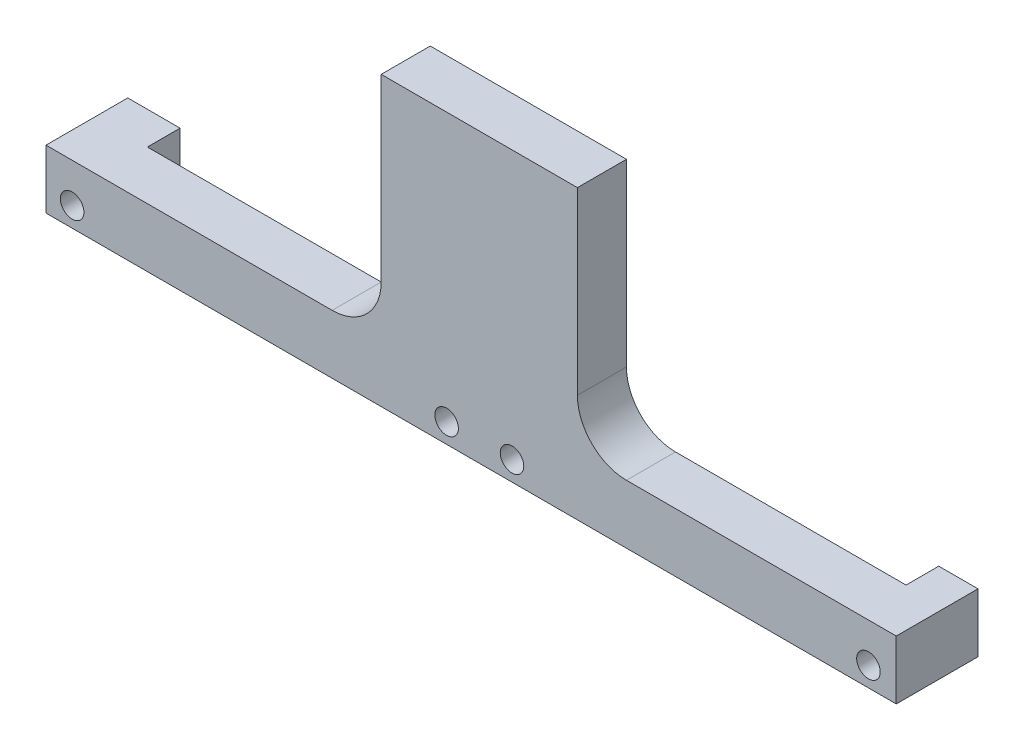
ISO-10303-21;
HEADER;
FILE_DESCRIPTION(('STEP AP214'),'2;1');
FILE_NAME('part.step','',(''),(''),'','','');
FILE_SCHEMA(('AUTOMOTIVE_DESIGN { 1 0 10303 214 1 1 1 1 }'));
ENDSEC;
DATA;
#1=APPLICATION_CONTEXT('core data for automotive mechanical design processes');
#2=APPLICATION_PROTOCOL_DEFINITION('international standard','automotive_design',2000,#1);
#3=PRODUCT_CONTEXT('',#1,'mechanical');
#4=PRODUCT('Part','Part','',(#3));
#5=PRODUCT_RELATED_PRODUCT_CATEGORY('part','',(#4));
#6=PRODUCT_DEFINITION_FORMATION('','',#4);
#7=PRODUCT_DEFINITION_CONTEXT('part definition',#1,'design');
#8=PRODUCT_DEFINITION('design','',#6,#7);
#9=PRODUCT_DEFINITION_SHAPE('','',#8);
#10=(LENGTH_UNIT() NAMED_UNIT(*) SI_UNIT(.MILLI.,.METRE.));
#11=(NAMED_UNIT(*) PLANE_ANGLE_UNIT() SI_UNIT($,.RADIAN.));
#12=(NAMED_UNIT(*) SI_UNIT($,.STERADIAN.) SOLID_ANGLE_UNIT());
#13=UNCERTAINTY_MEASURE_WITH_UNIT(LENGTH_MEASURE(1.E-05),#10,'distance_accuracy_value','');
#14=(GEOMETRIC_REPRESENTATION_CONTEXT(3) GLOBAL_UNCERTAINTY_ASSIGNED_CONTEXT((#13)) GLOBAL_UNIT_ASSIGNED_CONTEXT((#10,
#11,#12)) REPRESENTATION_CONTEXT('',''));
#15=CARTESIAN_POINT('',(0.,0.,0.));
#16=DIRECTION('',(0.,0.,1.));
#17=DIRECTION('',(1.,0.,0.));
#18=AXIS2_PLACEMENT_3D('',#15,#16,#17);
#19=CARTESIAN_POINT('',(0.,0.,0.));
#20=DIRECTION('',(0.,0.,1.));
#21=DIRECTION('',(1.,0.,0.));
#22=AXIS2_PLACEMENT_3D('',#19,#20,#21);
#23=PLANE('',#22);
#24=DIRECTION('',(0.,1.,0.));
#25=VECTOR('',#24,1.);
#26=CARTESIAN_POINT('',(124.,0.,0.));
#27=LINE('',#26,#25);
#28=CARTESIAN_POINT('',(124.,0.,0.));
#29=VERTEX_POINT('',#28);
#30=CARTESIAN_POINT('',(124.,2.57869251134121,0.));
#31=VERTEX_POINT('',#30);
#32=EDGE_CURVE('E54',#29,#31,#27,.T.);
#33=ORIENTED_EDGE('',*,*,#32,.F.);
#34=DIRECTION('',(1.,0.,0.));
#35=VECTOR('',#34,1.);
#36=CARTESIAN_POINT('',(0.,0.,0.));
#37=LINE('',#36,#35);
#38=CARTESIAN_POINT('',(76.25,0.,0.));
#39=VERTEX_POINT('',#38);
#40=EDGE_CURVE('E280',#39,#29,#37,.T.);
#41=ORIENTED_EDGE('',*,*,#40,.F.);
#42=DIRECTION('',(0.,-1.,0.));
#43=VECTOR('',#42,1.);
#44=CARTESIAN_POINT('',(76.25,0.,0.));
#45=LINE('',#44,#43);
#46=CARTESIAN_POINT('',(76.25,6.,0.));
#47=VERTEX_POINT('',#46);
#48=EDGE_CURVE('E240',#47,#39,#45,.T.);
#49=ORIENTED_EDGE('',*,*,#48,.F.);
#50=DIRECTION('',(1.,0.,0.));
#51=VECTOR('',#50,1.);
#52=CARTESIAN_POINT('',(76.25,6.,0.));
#53=LINE('',#52,#51);
#54=CARTESIAN_POINT('',(56.25,6.,0.));
#55=VERTEX_POINT('',#54);
#56=EDGE_CURVE('E245',#55,#47,#53,.T.);
#57=ORIENTED_EDGE('',*,*,#56,.F.);
#58=DIRECTION('',(0.,1.,0.));
#59=VECTOR('',#58,1.);
#60=CARTESIAN_POINT('',(56.25,0.,0.));
#61=LINE('',#60,#59);
#62=CARTESIAN_POINT('',(56.25,0.,0.));
#63=VERTEX_POINT('',#62);
#64=EDGE_CURVE('E254',#63,#55,#61,.T.);
#65=ORIENTED_EDGE('',*,*,#64,.F.);
#66=CARTESIAN_POINT('',(8.,0.,0.));
#67=VERTEX_POINT('',#66);
#68=EDGE_CURVE('E302',#67,#63,#37,.T.);
#69=ORIENTED_EDGE('',*,*,#68,.F.);
#70=DIRECTION('',(0.,-1.,0.));
#71=VECTOR('',#70,1.);
#72=CARTESIAN_POINT('',(8.,0.,0.));
#73=LINE('',#72,#71);
#74=CARTESIAN_POINT('',(8.,8.99999999999999,0.));
#75=VERTEX_POINT('',#74);
#76=EDGE_CURVE('E220',#75,#67,#73,.T.);
#77=ORIENTED_EDGE('',*,*,#76,.F.);
#78=DIRECTION('',(-1.,0.,0.));
#79=VECTOR('',#78,1.);
#80=CARTESIAN_POINT('',(51.25,8.99999999999999,0.));
#81=LINE('',#80,#79);
#82=CARTESIAN_POINT('',(43.75,8.99999999999999,0.));
#83=VERTEX_POINT('',#82);
#84=EDGE_CURVE('E285',#83,#75,#81,.T.);
#85=ORIENTED_EDGE('',*,*,#84,.F.);
#86=CARTESIAN_POINT('',(43.75,16.5,0.));
#87=DIRECTION('',(0.,0.,1.));
#88=DIRECTION('',(1.,0.,0.));
#89=AXIS2_PLACEMENT_3D('',#86,#87,#88);
#90=CIRCLE('',#89,7.5);
#91=CARTESIAN_POINT('',(51.25,16.5,0.));
#92=VERTEX_POINT('',#91);
#93=EDGE_CURVE('E47',#83,#92,#90,.T.);
#94=ORIENTED_EDGE('',*,*,#93,.T.);
#95=DIRECTION('',(0.,-1.,0.));
#96=VECTOR('',#95,1.);
#97=CARTESIAN_POINT('',(51.25,44.,0.));
#98=LINE('',#97,#96);
#99=CARTESIAN_POINT('',(51.25,44.,0.));
#100=VERTEX_POINT('',#99);
#101=EDGE_CURVE('E309',#100,#92,#98,.T.);
#102=ORIENTED_EDGE('',*,*,#101,.F.);
#103=DIRECTION('',(-1.,0.,0.));
#104=VECTOR('',#103,1.);
#105=CARTESIAN_POINT('',(81.25,44.,0.));
#106=LINE('',#105,#104);
#107=CARTESIAN_POINT('',(81.25,44.,0.));
#108=VERTEX_POINT('',#107);
#109=EDGE_CURVE('E307',#108,#100,#106,.T.);
#110=ORIENTED_EDGE('',*,*,#109,.F.);
#111=DIRECTION('',(0.,1.,0.));
#112=VECTOR('',#111,1.);
#113=CARTESIAN_POINT('',(81.25,8.99999999999999,0.));
#114=LINE('',#113,#112);
#115=CARTESIAN_POINT('',(81.25,16.5,0.));
#116=VERTEX_POINT('',#115);
#117=EDGE_CURVE('E305',#116,#108,#114,.T.);
#118=ORIENTED_EDGE('',*,*,#117,.F.);
#119=CARTESIAN_POINT('',(88.75,16.5,0.));
#120=DIRECTION('',(0.,0.,1.));
#121=DIRECTION('',(1.,0.,0.));
#122=AXIS2_PLACEMENT_3D('',#119,#120,#121);
#123=CIRCLE('',#122,7.5);
#124=CARTESIAN_POINT('',(88.75,8.99999999999999,0.));
#125=VERTEX_POINT('',#124);
#126=EDGE_CURVE('E337',#116,#125,#123,.T.);
#127=ORIENTED_EDGE('',*,*,#126,.T.);
#128=DIRECTION('',(-1.,0.,0.));
#129=VECTOR('',#128,1.);
#130=CARTESIAN_POINT('',(130.,9.,0.));
#131=LINE('',#130,#129);
#132=CARTESIAN_POINT('',(124.,9.,0.));
#133=VERTEX_POINT('',#132);
#134=EDGE_CURVE('E61',#133,#125,#131,.T.);
#135=ORIENTED_EDGE('',*,*,#134,.F.);
#136=DIRECTION('',(0.,1.,0.));
#137=VECTOR('',#136,1.);
#138=CARTESIAN_POINT('',(124.,9.,0.));
#139=LINE('',#138,#137);
#140=CARTESIAN_POINT('',(124.,3.42130748865879,0.));
#141=VERTEX_POINT('',#140);
#142=EDGE_CURVE('E186',#141,#133,#139,.T.);
#143=ORIENTED_EDGE('',*,*,#142,.F.);
#144=CARTESIAN_POINT('',(125.75,3.,0.));
#145=DIRECTION('',(0.,0.,1.));
#146=DIRECTION('',(1.,0.,0.));
#147=AXIS2_PLACEMENT_3D('',#144,#145,#146);
#148=CIRCLE('',#147,1.80000000000001);
#149=EDGE_CURVE('E175',#141,#31,#148,.T.);
#150=ORIENTED_EDGE('',*,*,#149,.T.);
#151=EDGE_LOOP('',(#33,#41,#49,#57,#65,#69,#77,#85,#94,#102,#110,#118,#127,#135,#143,#150));
#152=FACE_BOUND('',#151,.T.);
#153=ADVANCED_FACE('F39',(#152),#23,.F.);
#154=CARTESIAN_POINT('',(0.,0.,7.5));
#155=DIRECTION('',(0.,0.,1.));
#156=DIRECTION('',(1.,0.,0.));
#157=AXIS2_PLACEMENT_3D('',#154,#155,#156);
#158=PLANE('',#157);
#159=CARTESIAN_POINT('',(71.25,3.,7.5));
#160=DIRECTION('',(0.,0.,1.));
#161=DIRECTION('',(1.,0.,0.));
#162=AXIS2_PLACEMENT_3D('',#159,#160,#161);
#163=CIRCLE('',#162,1.79999999999999);
#164=CARTESIAN_POINT('',(73.05,3.,7.5));
#165=VERTEX_POINT('',#164);
#166=EDGE_CURVE('E270',#165,#165,#163,.T.);
#167=ORIENTED_EDGE('',*,*,#166,.F.);
#168=EDGE_LOOP('',(#167));
#169=FACE_BOUND('',#168,.T.);
#170=CARTESIAN_POINT('',(4.,3.,7.5));
#171=DIRECTION('',(0.,0.,1.));
#172=DIRECTION('',(1.,0.,0.));
#173=AXIS2_PLACEMENT_3D('',#170,#171,#172);
#174=CIRCLE('',#173,1.8);
#175=CARTESIAN_POINT('',(5.8,3.,7.5));
#176=VERTEX_POINT('',#175);
#177=EDGE_CURVE('E277',#176,#176,#174,.T.);
#178=ORIENTED_EDGE('',*,*,#177,.F.);
#179=EDGE_LOOP('',(#178));
#180=FACE_BOUND('',#179,.T.);
#181=DIRECTION('',(0.,-1.,0.));
#182=VECTOR('',#181,1.);
#183=CARTESIAN_POINT('',(0.,9.,7.5));
#184=LINE('',#183,#182);
#185=CARTESIAN_POINT('',(0.,9.,7.5));
#186=VERTEX_POINT('',#185);
#187=CARTESIAN_POINT('',(0.,0.,7.5));
#188=VERTEX_POINT('',#187);
#189=EDGE_CURVE('E281',#186,#188,#184,.T.);
#190=ORIENTED_EDGE('',*,*,#189,.T.);
#191=DIRECTION('',(1.,0.,0.));
#192=VECTOR('',#191,1.);
#193=CARTESIAN_POINT('',(0.,0.,7.5));
#194=LINE('',#193,#192);
#195=CARTESIAN_POINT('',(130.,0.,7.5));
#196=VERTEX_POINT('',#195);
#197=EDGE_CURVE('E284',#188,#196,#194,.T.);
#198=ORIENTED_EDGE('',*,*,#197,.T.);
#199=DIRECTION('',(0.,1.,0.));
#200=VECTOR('',#199,1.);
#201=CARTESIAN_POINT('',(130.,0.,7.5));
#202=LINE('',#201,#200);
#203=CARTESIAN_POINT('',(130.,9.,7.5));
#204=VERTEX_POINT('',#203);
#205=EDGE_CURVE('E287',#196,#204,#202,.T.);
#206=ORIENTED_EDGE('',*,*,#205,.T.);
#207=DIRECTION('',(-1.,0.,0.));
#208=VECTOR('',#207,1.);
#209=CARTESIAN_POINT('',(130.,9.,7.5));
#210=LINE('',#209,#208);
#211=CARTESIAN_POINT('',(88.75,8.99999999999999,7.5));
#212=VERTEX_POINT('',#211);
#213=EDGE_CURVE('E289',#204,#212,#210,.T.);
#214=ORIENTED_EDGE('',*,*,#213,.T.);
#215=CARTESIAN_POINT('',(88.75,16.5,7.5));
#216=DIRECTION('',(0.,0.,1.));
#217=DIRECTION('',(1.,0.,0.));
#218=AXIS2_PLACEMENT_3D('',#215,#216,#217);
#219=CIRCLE('',#218,7.5);
#220=CARTESIAN_POINT('',(81.25,16.5,7.5));
#221=VERTEX_POINT('',#220);
#222=EDGE_CURVE('E339',#212,#221,#219,.F.);
#223=ORIENTED_EDGE('',*,*,#222,.T.);
#224=DIRECTION('',(0.,1.,0.));
#225=VECTOR('',#224,1.);
#226=CARTESIAN_POINT('',(81.25,8.99999999999999,7.5));
#227=LINE('',#226,#225);
#228=CARTESIAN_POINT('',(81.25,44.,7.5));
#229=VERTEX_POINT('',#228);
#230=EDGE_CURVE('E292',#221,#229,#227,.T.);
#231=ORIENTED_EDGE('',*,*,#230,.T.);
#232=DIRECTION('',(-1.,0.,0.));
#233=VECTOR('',#232,1.);
#234=CARTESIAN_POINT('',(81.25,44.,7.5));
#235=LINE('',#234,#233);
#236=CARTESIAN_POINT('',(51.25,44.,7.5));
#237=VERTEX_POINT('',#236);
#238=EDGE_CURVE('E294',#229,#237,#235,.T.);
#239=ORIENTED_EDGE('',*,*,#238,.T.);
#240=DIRECTION('',(0.,-1.,0.));
#241=VECTOR('',#240,1.);
#242=CARTESIAN_POINT('',(51.25,44.,7.5));
#243=LINE('',#242,#241);
#244=CARTESIAN_POINT('',(51.25,16.5,7.5));
#245=VERTEX_POINT('',#244);
#246=EDGE_CURVE('E296',#237,#245,#243,.T.);
#247=ORIENTED_EDGE('',*,*,#246,.T.);
#248=CARTESIAN_POINT('',(43.75,16.5,7.5));
#249=DIRECTION('',(0.,0.,1.));
#250=DIRECTION('',(1.,0.,0.));
#251=AXIS2_PLACEMENT_3D('',#248,#249,#250);
#252=CIRCLE('',#251,7.5);
#253=CARTESIAN_POINT('',(43.75,8.99999999999999,7.5));
#254=VERTEX_POINT('',#253);
#255=EDGE_CURVE('E11',#245,#254,#252,.F.);
#256=ORIENTED_EDGE('',*,*,#255,.T.);
#257=DIRECTION('',(-1.,0.,0.));
#258=VECTOR('',#257,1.);
#259=CARTESIAN_POINT('',(51.25,8.99999999999999,7.5));
#260=LINE('',#259,#258);
#261=EDGE_CURVE('E299',#254,#186,#260,.T.);
#262=ORIENTED_EDGE('',*,*,#261,.T.);
#263=EDGE_LOOP('',(#190,#198,#206,#214,#223,#231,#239,#247,#256,#262));
#264=FACE_BOUND('',#263,.T.);
#265=CARTESIAN_POINT('',(61.25,3.,7.5));
#266=DIRECTION('',(0.,0.,1.));
#267=DIRECTION('',(1.,0.,0.));
#268=AXIS2_PLACEMENT_3D('',#265,#266,#267);
#269=CIRCLE('',#268,1.79999999999999);
#270=CARTESIAN_POINT('',(63.05,3.,7.5));
#271=VERTEX_POINT('',#270);
#272=EDGE_CURVE('E274',#271,#271,#269,.T.);
#273=ORIENTED_EDGE('',*,*,#272,.F.);
#274=EDGE_LOOP('',(#273));
#275=FACE_BOUND('',#274,.T.);
#276=CARTESIAN_POINT('',(125.75,3.,7.5));
#277=DIRECTION('',(0.,0.,1.));
#278=DIRECTION('',(1.,0.,0.));
#279=AXIS2_PLACEMENT_3D('',#276,#277,#278);
#280=CIRCLE('',#279,1.80000000000001);
#281=CARTESIAN_POINT('',(127.55,3.,7.5));
#282=VERTEX_POINT('',#281);
#283=EDGE_CURVE('E183',#282,#282,#280,.T.);
#284=ORIENTED_EDGE('',*,*,#283,.F.);
#285=EDGE_LOOP('',(#284));
#286=FACE_BOUND('',#285,.T.);
#287=ADVANCED_FACE('F354',(#169,#180,#264,#275,#286),#158,.T.);
#288=CARTESIAN_POINT('',(0.,9.,7.5));
#289=DIRECTION('',(1.,0.,0.));
#290=DIRECTION('',(0.,0.,-1.));
#291=AXIS2_PLACEMENT_3D('',#288,#289,#290);
#292=PLANE('',#291);
#293=DIRECTION('',(0.,0.,-1.));
#294=VECTOR('',#293,1.);
#295=CARTESIAN_POINT('',(0.,9.,7.5));
#296=LINE('',#295,#294);
#297=CARTESIAN_POINT('',(0.,9.,-5.));
#298=VERTEX_POINT('',#297);
#299=EDGE_CURVE('E301',#186,#298,#296,.T.);
#300=ORIENTED_EDGE('',*,*,#299,.T.);
#301=DIRECTION('',(0.,1.,0.));
#302=VECTOR('',#301,1.);
#303=CARTESIAN_POINT('',(0.,0.,-5.));
#304=LINE('',#303,#302);
#305=CARTESIAN_POINT('',(0.,0.,-5.));
#306=VERTEX_POINT('',#305);
#307=EDGE_CURVE('E223',#306,#298,#304,.T.);
#308=ORIENTED_EDGE('',*,*,#307,.F.);
#309=DIRECTION('',(0.,0.,-1.));
#310=VECTOR('',#309,1.);
#311=CARTESIAN_POINT('',(0.,0.,7.5));
#312=LINE('',#311,#310);
#313=EDGE_CURVE('E325',#188,#306,#312,.T.);
#314=ORIENTED_EDGE('',*,*,#313,.F.);
#315=ORIENTED_EDGE('',*,*,#189,.F.);
#316=EDGE_LOOP('',(#300,#308,#314,#315));
#317=FACE_BOUND('',#316,.T.);
#318=ADVANCED_FACE('F365',(#317),#292,.F.);
#319=CARTESIAN_POINT('',(0.,0.,7.5));
#320=DIRECTION('',(0.,1.,0.));
#321=DIRECTION('',(0.,0.,1.));
#322=AXIS2_PLACEMENT_3D('',#319,#320,#321);
#323=PLANE('',#322);
#324=ORIENTED_EDGE('',*,*,#313,.T.);
#325=DIRECTION('',(-1.,0.,0.));
#326=VECTOR('',#325,1.);
#327=CARTESIAN_POINT('',(0.,0.,-5.));
#328=LINE('',#327,#326);
#329=CARTESIAN_POINT('',(8.,0.,-5.));
#330=VERTEX_POINT('',#329);
#331=EDGE_CURVE('E219',#330,#306,#328,.T.);
#332=ORIENTED_EDGE('',*,*,#331,.F.);
#333=DIRECTION('',(0.,0.,1.));
#334=VECTOR('',#333,1.);
#335=CARTESIAN_POINT('',(8.,0.,-5.));
#336=LINE('',#335,#334);
#337=EDGE_CURVE('E216',#330,#67,#336,.T.);
#338=ORIENTED_EDGE('',*,*,#337,.T.);
#339=ORIENTED_EDGE('',*,*,#68,.T.);
#340=DIRECTION('',(0.,0.,1.));
#341=VECTOR('',#340,1.);
#342=CARTESIAN_POINT('',(56.25,0.,-5.));
#343=LINE('',#342,#341);
#344=CARTESIAN_POINT('',(56.25,0.,-5.));
#345=VERTEX_POINT('',#344);
#346=EDGE_CURVE('E264',#345,#63,#343,.T.);
#347=ORIENTED_EDGE('',*,*,#346,.F.);
#348=DIRECTION('',(-1.,0.,0.));
#349=VECTOR('',#348,1.);
#350=CARTESIAN_POINT('',(76.25,0.,-5.));
#351=LINE('',#350,#349);
#352=CARTESIAN_POINT('',(76.25,0.,-5.));
#353=VERTEX_POINT('',#352);
#354=EDGE_CURVE('E244',#353,#345,#351,.T.);
#355=ORIENTED_EDGE('',*,*,#354,.F.);
#356=DIRECTION('',(0.,0.,1.));
#357=VECTOR('',#356,1.);
#358=CARTESIAN_POINT('',(76.25,0.,-5.));
#359=LINE('',#358,#357);
#360=EDGE_CURVE('E184',#353,#39,#359,.T.);
#361=ORIENTED_EDGE('',*,*,#360,.T.);
#362=ORIENTED_EDGE('',*,*,#40,.T.);
#363=DIRECTION('',(0.,0.,1.));
#364=VECTOR('',#363,1.);
#365=CARTESIAN_POINT('',(124.,0.,-5.));
#366=LINE('',#365,#364);
#367=CARTESIAN_POINT('',(124.,0.,-5.));
#368=VERTEX_POINT('',#367);
#369=EDGE_CURVE('E198',#368,#29,#366,.T.);
#370=ORIENTED_EDGE('',*,*,#369,.F.);
#371=DIRECTION('',(-1.,0.,0.));
#372=VECTOR('',#371,1.);
#373=CARTESIAN_POINT('',(130.,0.,-5.));
#374=LINE('',#373,#372);
#375=CARTESIAN_POINT('',(130.,0.,-5.));
#376=VERTEX_POINT('',#375);
#377=EDGE_CURVE('E211',#376,#368,#374,.T.);
#378=ORIENTED_EDGE('',*,*,#377,.F.);
#379=DIRECTION('',(0.,0.,-1.));
#380=VECTOR('',#379,1.);
#381=CARTESIAN_POINT('',(130.,0.,7.5));
#382=LINE('',#381,#380);
#383=EDGE_CURVE('E323',#196,#376,#382,.T.);
#384=ORIENTED_EDGE('',*,*,#383,.F.);
#385=ORIENTED_EDGE('',*,*,#197,.F.);
#386=EDGE_LOOP('',(#324,#332,#338,#339,#347,#355,#361,#362,#370,#378,#384,#385));
#387=FACE_BOUND('',#386,.T.);
#388=ADVANCED_FACE('F371',(#387),#323,.F.);
#389=CARTESIAN_POINT('',(130.,0.,7.5));
#390=DIRECTION('',(-1.,0.,0.));
#391=DIRECTION('',(0.,0.,1.));
#392=AXIS2_PLACEMENT_3D('',#389,#390,#391);
#393=PLANE('',#392);
#394=ORIENTED_EDGE('',*,*,#383,.T.);
#395=DIRECTION('',(0.,-1.,0.));
#396=VECTOR('',#395,1.);
#397=CARTESIAN_POINT('',(130.,0.,-5.));
#398=LINE('',#397,#396);
#399=CARTESIAN_POINT('',(130.,9.,-5.));
#400=VERTEX_POINT('',#399);
#401=EDGE_CURVE('E190',#400,#376,#398,.T.);
#402=ORIENTED_EDGE('',*,*,#401,.F.);
#403=DIRECTION('',(0.,0.,-1.));
#404=VECTOR('',#403,1.);
#405=CARTESIAN_POINT('',(130.,9.,7.5));
#406=LINE('',#405,#404);
#407=EDGE_CURVE('E321',#204,#400,#406,.T.);
#408=ORIENTED_EDGE('',*,*,#407,.F.);
#409=ORIENTED_EDGE('',*,*,#205,.F.);
#410=EDGE_LOOP('',(#394,#402,#408,#409));
#411=FACE_BOUND('',#410,.T.);
#412=ADVANCED_FACE('F375',(#411),#393,.F.);
#413=CARTESIAN_POINT('',(130.,9.,7.5));
#414=DIRECTION('',(0.,-1.,0.));
#415=DIRECTION('',(1.,0.,0.));
#416=AXIS2_PLACEMENT_3D('',#413,#414,#415);
#417=PLANE('',#416);
#418=ORIENTED_EDGE('',*,*,#407,.T.);
#419=DIRECTION('',(1.,0.,0.));
#420=VECTOR('',#419,1.);
#421=CARTESIAN_POINT('',(130.,9.,-5.));
#422=LINE('',#421,#420);
#423=CARTESIAN_POINT('',(124.,9.,-5.));
#424=VERTEX_POINT('',#423);
#425=EDGE_CURVE('E196',#424,#400,#422,.T.);
#426=ORIENTED_EDGE('',*,*,#425,.F.);
#427=DIRECTION('',(0.,0.,1.));
#428=VECTOR('',#427,1.);
#429=CARTESIAN_POINT('',(124.,9.,-5.));
#430=LINE('',#429,#428);
#431=EDGE_CURVE('E194',#424,#133,#430,.T.);
#432=ORIENTED_EDGE('',*,*,#431,.T.);
#433=ORIENTED_EDGE('',*,*,#134,.T.);
#434=DIRECTION('',(0.,0.,-1.));
#435=VECTOR('',#434,1.);
#436=CARTESIAN_POINT('',(88.75,8.99999999999999,7.5));
#437=LINE('',#436,#435);
#438=EDGE_CURVE('E330',#125,#212,#437,.F.);
#439=ORIENTED_EDGE('',*,*,#438,.T.);
#440=ORIENTED_EDGE('',*,*,#213,.F.);
#441=EDGE_LOOP('',(#418,#426,#432,#433,#439,#440));
#442=FACE_BOUND('',#441,.T.);
#443=ADVANCED_FACE('F379',(#442),#417,.F.);
#444=CARTESIAN_POINT('',(81.25,8.99999999999999,7.5));
#445=DIRECTION('',(-1.,0.,0.));
#446=DIRECTION('',(0.,-1.,0.));
#447=AXIS2_PLACEMENT_3D('',#444,#445,#446);
#448=PLANE('',#447);
#449=ORIENTED_EDGE('',*,*,#230,.F.);
#450=DIRECTION('',(0.,0.,-1.));
#451=VECTOR('',#450,1.);
#452=CARTESIAN_POINT('',(81.25,16.5,0.));
#453=LINE('',#452,#451);
#454=EDGE_CURVE('E327',#221,#116,#453,.T.);
#455=ORIENTED_EDGE('',*,*,#454,.T.);
#456=ORIENTED_EDGE('',*,*,#117,.T.);
#457=DIRECTION('',(0.,0.,-1.));
#458=VECTOR('',#457,1.);
#459=CARTESIAN_POINT('',(81.25,44.,7.5));
#460=LINE('',#459,#458);
#461=EDGE_CURVE('E318',#229,#108,#460,.T.);
#462=ORIENTED_EDGE('',*,*,#461,.F.);
#463=EDGE_LOOP('',(#449,#455,#456,#462));
#464=FACE_BOUND('',#463,.T.);
#465=ADVANCED_FACE('F388',(#464),#448,.F.);
#466=CARTESIAN_POINT('',(81.25,44.,7.5));
#467=DIRECTION('',(0.,-1.,0.));
#468=DIRECTION('',(1.,0.,0.));
#469=AXIS2_PLACEMENT_3D('',#466,#467,#468);
#470=PLANE('',#469);
#471=ORIENTED_EDGE('',*,*,#109,.T.);
#472=DIRECTION('',(0.,0.,-1.));
#473=VECTOR('',#472,1.);
#474=CARTESIAN_POINT('',(51.25,44.,7.5));
#475=LINE('',#474,#473);
#476=EDGE_CURVE('E315',#237,#100,#475,.T.);
#477=ORIENTED_EDGE('',*,*,#476,.F.);
#478=ORIENTED_EDGE('',*,*,#238,.F.);
#479=ORIENTED_EDGE('',*,*,#461,.T.);
#480=EDGE_LOOP('',(#471,#477,#478,#479));
#481=FACE_BOUND('',#480,.T.);
#482=ADVANCED_FACE('F391',(#481),#470,.F.);
#483=CARTESIAN_POINT('',(51.25,44.,7.5));
#484=DIRECTION('',(1.,0.,0.));
#485=DIRECTION('',(0.,1.,0.));
#486=AXIS2_PLACEMENT_3D('',#483,#484,#485);
#487=PLANE('',#486);
#488=ORIENTED_EDGE('',*,*,#101,.T.);
#489=DIRECTION('',(0.,0.,-1.));
#490=VECTOR('',#489,1.);
#491=CARTESIAN_POINT('',(51.25,16.5,7.5));
#492=LINE('',#491,#490);
#493=EDGE_CURVE('E335',#92,#245,#492,.F.);
#494=ORIENTED_EDGE('',*,*,#493,.T.);
#495=ORIENTED_EDGE('',*,*,#246,.F.);
#496=ORIENTED_EDGE('',*,*,#476,.T.);
#497=EDGE_LOOP('',(#488,#494,#495,#496));
#498=FACE_BOUND('',#497,.T.);
#499=ADVANCED_FACE('F348',(#498),#487,.F.);
#500=CARTESIAN_POINT('',(51.25,8.99999999999999,7.5));
#501=DIRECTION('',(0.,-1.,0.));
#502=DIRECTION('',(1.,0.,0.));
#503=AXIS2_PLACEMENT_3D('',#500,#501,#502);
#504=PLANE('',#503);
#505=ORIENTED_EDGE('',*,*,#261,.F.);
#506=DIRECTION('',(0.,0.,-1.));
#507=VECTOR('',#506,1.);
#508=CARTESIAN_POINT('',(43.75,8.99999999999999,0.));
#509=LINE('',#508,#507);
#510=EDGE_CURVE('E332',#254,#83,#509,.T.);
#511=ORIENTED_EDGE('',*,*,#510,.T.);
#512=ORIENTED_EDGE('',*,*,#84,.T.);
#513=DIRECTION('',(0.,0.,1.));
#514=VECTOR('',#513,1.);
#515=CARTESIAN_POINT('',(8.,8.99999999999999,-5.));
#516=LINE('',#515,#514);
#517=CARTESIAN_POINT('',(8.,8.99999999999999,-5.));
#518=VERTEX_POINT('',#517);
#519=EDGE_CURVE('E203',#518,#75,#516,.T.);
#520=ORIENTED_EDGE('',*,*,#519,.F.);
#521=DIRECTION('',(1.,0.,0.));
#522=VECTOR('',#521,1.);
#523=CARTESIAN_POINT('',(0.,9.,-5.));
#524=LINE('',#523,#522);
#525=EDGE_CURVE('E228',#298,#518,#524,.T.);
#526=ORIENTED_EDGE('',*,*,#525,.F.);
#527=ORIENTED_EDGE('',*,*,#299,.F.);
#528=EDGE_LOOP('',(#505,#511,#512,#520,#526,#527));
#529=FACE_BOUND('',#528,.T.);
#530=ADVANCED_FACE('F358',(#529),#504,.F.);
#531=CARTESIAN_POINT('',(4.,3.,7.5));
#532=DIRECTION('',(0.,0.,-1.));
#533=DIRECTION('',(-1.,0.,0.));
#534=AXIS2_PLACEMENT_3D('',#531,#532,#533);
#535=CYLINDRICAL_SURFACE('',#534,1.8);
#536=ORIENTED_EDGE('',*,*,#177,.T.);
#537=EDGE_LOOP('',(#536));
#538=FACE_BOUND('',#537,.T.);
#539=CARTESIAN_POINT('',(4.,3.,-5.));
#540=DIRECTION('',(0.,0.,-1.));
#541=DIRECTION('',(-1.,0.,0.));
#542=AXIS2_PLACEMENT_3D('',#539,#540,#541);
#543=CIRCLE('',#542,1.8);
#544=CARTESIAN_POINT('',(2.2,3.,-5.));
#545=VERTEX_POINT('',#544);
#546=EDGE_CURVE('E222',#545,#545,#543,.T.);
#547=ORIENTED_EDGE('',*,*,#546,.T.);
#548=EDGE_LOOP('',(#547));
#549=FACE_BOUND('',#548,.T.);
#550=ADVANCED_FACE('F413',(#538,#549),#535,.F.);
#551=CARTESIAN_POINT('',(61.25,3.,7.5));
#552=DIRECTION('',(0.,0.,-1.));
#553=DIRECTION('',(-1.,0.,0.));
#554=AXIS2_PLACEMENT_3D('',#551,#552,#553);
#555=CYLINDRICAL_SURFACE('',#554,1.79999999999999);
#556=ORIENTED_EDGE('',*,*,#272,.T.);
#557=EDGE_LOOP('',(#556));
#558=FACE_BOUND('',#557,.T.);
#559=CARTESIAN_POINT('',(61.25,3.,-5.));
#560=DIRECTION('',(0.,0.,-1.));
#561=DIRECTION('',(-1.,0.,0.));
#562=AXIS2_PLACEMENT_3D('',#559,#560,#561);
#563=CIRCLE('',#562,1.79999999999999);
#564=CARTESIAN_POINT('',(59.45,3.,-5.));
#565=VERTEX_POINT('',#564);
#566=EDGE_CURVE('E234',#565,#565,#563,.T.);
#567=ORIENTED_EDGE('',*,*,#566,.T.);
#568=EDGE_LOOP('',(#567));
#569=FACE_BOUND('',#568,.T.);
#570=ADVANCED_FACE('F418',(#558,#569),#555,.F.);
#571=CARTESIAN_POINT('',(71.25,3.,7.5));
#572=DIRECTION('',(0.,0.,-1.));
#573=DIRECTION('',(-1.,0.,0.));
#574=AXIS2_PLACEMENT_3D('',#571,#572,#573);
#575=CYLINDRICAL_SURFACE('',#574,1.79999999999999);
#576=ORIENTED_EDGE('',*,*,#166,.T.);
#577=EDGE_LOOP('',(#576));
#578=FACE_BOUND('',#577,.T.);
#579=CARTESIAN_POINT('',(71.25,3.,-5.));
#580=DIRECTION('',(0.,0.,-1.));
#581=DIRECTION('',(-1.,0.,0.));
#582=AXIS2_PLACEMENT_3D('',#579,#580,#581);
#583=CIRCLE('',#582,1.79999999999999);
#584=CARTESIAN_POINT('',(69.45,3.,-5.));
#585=VERTEX_POINT('',#584);
#586=EDGE_CURVE('E237',#585,#585,#583,.T.);
#587=ORIENTED_EDGE('',*,*,#586,.T.);
#588=EDGE_LOOP('',(#587));
#589=FACE_BOUND('',#588,.T.);
#590=ADVANCED_FACE('F423',(#578,#589),#575,.F.);
#591=CARTESIAN_POINT('',(125.75,3.,7.5));
#592=DIRECTION('',(0.,0.,-1.));
#593=DIRECTION('',(-1.,0.,0.));
#594=AXIS2_PLACEMENT_3D('',#591,#592,#593);
#595=CYLINDRICAL_SURFACE('',#594,1.80000000000001);
#596=ORIENTED_EDGE('',*,*,#283,.T.);
#597=EDGE_LOOP('',(#596));
#598=FACE_BOUND('',#597,.T.);
#599=ORIENTED_EDGE('',*,*,#149,.F.);
#600=DIRECTION('',(0.,0.,1.));
#601=VECTOR('',#600,1.);
#602=CARTESIAN_POINT('',(124.,3.42130748865879,-5.));
#603=LINE('',#602,#601);
#604=CARTESIAN_POINT('',(124.,3.42130748865879,-5.));
#605=VERTEX_POINT('',#604);
#606=EDGE_CURVE('E179',#605,#141,#603,.T.);
#607=ORIENTED_EDGE('',*,*,#606,.F.);
#608=CARTESIAN_POINT('',(125.75,3.,-5.));
#609=DIRECTION('',(0.,0.,1.));
#610=DIRECTION('',(-1.,0.,0.));
#611=AXIS2_PLACEMENT_3D('',#608,#609,#610);
#612=CIRCLE('',#611,1.8);
#613=CARTESIAN_POINT('',(124.,2.57869251134121,-5.));
#614=VERTEX_POINT('',#613);
#615=EDGE_CURVE('E207',#614,#605,#612,.T.);
#616=ORIENTED_EDGE('',*,*,#615,.F.);
#617=DIRECTION('',(0.,0.,1.));
#618=VECTOR('',#617,1.);
#619=CARTESIAN_POINT('',(124.,2.57869251134121,-5.));
#620=LINE('',#619,#618);
#621=EDGE_CURVE('E182',#614,#31,#620,.T.);
#622=ORIENTED_EDGE('',*,*,#621,.T.);
#623=EDGE_LOOP('',(#599,#607,#616,#622));
#624=FACE_BOUND('',#623,.T.);
#625=ADVANCED_FACE('F176',(#598,#624),#595,.F.);
#626=CARTESIAN_POINT('',(88.75,16.5,7.5));
#627=DIRECTION('',(0.,0.,1.));
#628=DIRECTION('',(1.,0.,0.));
#629=AXIS2_PLACEMENT_3D('',#626,#627,#628);
#630=CYLINDRICAL_SURFACE('',#629,7.5);
#631=ORIENTED_EDGE('',*,*,#222,.F.);
#632=ORIENTED_EDGE('',*,*,#438,.F.);
#633=ORIENTED_EDGE('',*,*,#126,.F.);
#634=ORIENTED_EDGE('',*,*,#454,.F.);
#635=EDGE_LOOP('',(#631,#632,#633,#634));
#636=FACE_BOUND('',#635,.T.);
#637=ADVANCED_FACE('F385',(#636),#630,.F.);
#638=CARTESIAN_POINT('',(43.75,16.5,7.5));
#639=DIRECTION('',(0.,0.,1.));
#640=DIRECTION('',(1.,0.,0.));
#641=AXIS2_PLACEMENT_3D('',#638,#639,#640);
#642=CYLINDRICAL_SURFACE('',#641,7.5);
#643=ORIENTED_EDGE('',*,*,#255,.F.);
#644=ORIENTED_EDGE('',*,*,#493,.F.);
#645=ORIENTED_EDGE('',*,*,#93,.F.);
#646=ORIENTED_EDGE('',*,*,#510,.F.);
#647=EDGE_LOOP('',(#643,#644,#645,#646));
#648=FACE_BOUND('',#647,.T.);
#649=ADVANCED_FACE('F41',(#648),#642,.F.);
#650=CARTESIAN_POINT('',(0.,0.,-5.));
#651=DIRECTION('',(0.,0.,1.));
#652=DIRECTION('',(1.,0.,0.));
#653=AXIS2_PLACEMENT_3D('',#650,#651,#652);
#654=PLANE('',#653);
#655=DIRECTION('',(0.,-1.,0.));
#656=VECTOR('',#655,1.);
#657=CARTESIAN_POINT('',(76.25,0.,-5.));
#658=LINE('',#657,#656);
#659=CARTESIAN_POINT('',(76.25,6.,-5.));
#660=VERTEX_POINT('',#659);
#661=EDGE_CURVE('E241',#660,#353,#658,.T.);
#662=ORIENTED_EDGE('',*,*,#661,.T.);
#663=ORIENTED_EDGE('',*,*,#354,.T.);
#664=DIRECTION('',(0.,1.,0.));
#665=VECTOR('',#664,1.);
#666=CARTESIAN_POINT('',(56.25,0.,-5.));
#667=LINE('',#666,#665);
#668=CARTESIAN_POINT('',(56.25,6.,-5.));
#669=VERTEX_POINT('',#668);
#670=EDGE_CURVE('E247',#345,#669,#667,.T.);
#671=ORIENTED_EDGE('',*,*,#670,.T.);
#672=DIRECTION('',(1.,0.,0.));
#673=VECTOR('',#672,1.);
#674=CARTESIAN_POINT('',(76.25,6.,-5.));
#675=LINE('',#674,#673);
#676=EDGE_CURVE('E249',#669,#660,#675,.T.);
#677=ORIENTED_EDGE('',*,*,#676,.T.);
#678=EDGE_LOOP('',(#662,#663,#671,#677));
#679=FACE_BOUND('',#678,.T.);
#680=ORIENTED_EDGE('',*,*,#586,.F.);
#681=EDGE_LOOP('',(#680));
#682=FACE_BOUND('',#681,.T.);
#683=ORIENTED_EDGE('',*,*,#566,.F.);
#684=EDGE_LOOP('',(#683));
#685=FACE_BOUND('',#684,.T.);
#686=ADVANCED_FACE('F438',(#679,#682,#685),#654,.F.);
#687=CARTESIAN_POINT('',(76.25,0.,-5.));
#688=DIRECTION('',(-1.,0.,0.));
#689=DIRECTION('',(0.,0.,1.));
#690=AXIS2_PLACEMENT_3D('',#687,#688,#689);
#691=PLANE('',#690);
#692=ORIENTED_EDGE('',*,*,#48,.T.);
#693=ORIENTED_EDGE('',*,*,#360,.F.);
#694=ORIENTED_EDGE('',*,*,#661,.F.);
#695=DIRECTION('',(0.,0.,1.));
#696=VECTOR('',#695,1.);
#697=CARTESIAN_POINT('',(76.25,6.,-5.));
#698=LINE('',#697,#696);
#699=EDGE_CURVE('E251',#660,#47,#698,.T.);
#700=ORIENTED_EDGE('',*,*,#699,.T.);
#701=EDGE_LOOP('',(#692,#693,#694,#700));
#702=FACE_BOUND('',#701,.T.);
#703=ADVANCED_FACE('F434',(#702),#691,.F.);
#704=CARTESIAN_POINT('',(56.25,0.,-5.));
#705=DIRECTION('',(1.,0.,0.));
#706=DIRECTION('',(0.,0.,-1.));
#707=AXIS2_PLACEMENT_3D('',#704,#705,#706);
#708=PLANE('',#707);
#709=ORIENTED_EDGE('',*,*,#64,.T.);
#710=DIRECTION('',(0.,0.,1.));
#711=VECTOR('',#710,1.);
#712=CARTESIAN_POINT('',(56.25,6.,-5.));
#713=LINE('',#712,#711);
#714=EDGE_CURVE('E261',#669,#55,#713,.T.);
#715=ORIENTED_EDGE('',*,*,#714,.F.);
#716=ORIENTED_EDGE('',*,*,#670,.F.);
#717=ORIENTED_EDGE('',*,*,#346,.T.);
#718=EDGE_LOOP('',(#709,#715,#716,#717));
#719=FACE_BOUND('',#718,.T.);
#720=ADVANCED_FACE('F437',(#719),#708,.F.);
#721=CARTESIAN_POINT('',(76.25,6.,-5.));
#722=DIRECTION('',(0.,-1.,0.));
#723=DIRECTION('',(0.,0.,-1.));
#724=AXIS2_PLACEMENT_3D('',#721,#722,#723);
#725=PLANE('',#724);
#726=ORIENTED_EDGE('',*,*,#56,.T.);
#727=ORIENTED_EDGE('',*,*,#699,.F.);
#728=ORIENTED_EDGE('',*,*,#676,.F.);
#729=ORIENTED_EDGE('',*,*,#714,.T.);
#730=EDGE_LOOP('',(#726,#727,#728,#729));
#731=FACE_BOUND('',#730,.T.);
#732=ADVANCED_FACE('F442',(#731),#725,.F.);
#733=CARTESIAN_POINT('',(0.,0.,-5.));
#734=DIRECTION('',(0.,0.,-1.));
#735=DIRECTION('',(-1.,0.,0.));
#736=AXIS2_PLACEMENT_3D('',#733,#734,#735);
#737=PLANE('',#736);
#738=ORIENTED_EDGE('',*,*,#307,.T.);
#739=ORIENTED_EDGE('',*,*,#525,.T.);
#740=DIRECTION('',(0.,-1.,0.));
#741=VECTOR('',#740,1.);
#742=CARTESIAN_POINT('',(8.,0.,-5.));
#743=LINE('',#742,#741);
#744=EDGE_CURVE('E226',#518,#330,#743,.T.);
#745=ORIENTED_EDGE('',*,*,#744,.T.);
#746=ORIENTED_EDGE('',*,*,#331,.T.);
#747=EDGE_LOOP('',(#738,#739,#745,#746));
#748=FACE_BOUND('',#747,.T.);
#749=ORIENTED_EDGE('',*,*,#546,.F.);
#750=EDGE_LOOP('',(#749));
#751=FACE_BOUND('',#750,.T.);
#752=ADVANCED_FACE('F446',(#748,#751),#737,.T.);
#753=CARTESIAN_POINT('',(8.,0.,-5.));
#754=DIRECTION('',(-1.,0.,0.));
#755=DIRECTION('',(0.,0.,1.));
#756=AXIS2_PLACEMENT_3D('',#753,#754,#755);
#757=PLANE('',#756);
#758=ORIENTED_EDGE('',*,*,#76,.T.);
#759=ORIENTED_EDGE('',*,*,#337,.F.);
#760=ORIENTED_EDGE('',*,*,#744,.F.);
#761=ORIENTED_EDGE('',*,*,#519,.T.);
#762=EDGE_LOOP('',(#758,#759,#760,#761));
#763=FACE_BOUND('',#762,.T.);
#764=ADVANCED_FACE('F453',(#763),#757,.F.);
#765=CARTESIAN_POINT('',(124.,0.,-5.));
#766=DIRECTION('',(1.,0.,0.));
#767=DIRECTION('',(0.,0.,-1.));
#768=AXIS2_PLACEMENT_3D('',#765,#766,#767);
#769=PLANE('',#768);
#770=ORIENTED_EDGE('',*,*,#32,.T.);
#771=ORIENTED_EDGE('',*,*,#621,.F.);
#772=DIRECTION('',(0.,1.,0.));
#773=VECTOR('',#772,1.);
#774=CARTESIAN_POINT('',(124.,0.,-5.));
#775=LINE('',#774,#773);
#776=EDGE_CURVE('E209',#368,#614,#775,.T.);
#777=ORIENTED_EDGE('',*,*,#776,.F.);
#778=ORIENTED_EDGE('',*,*,#369,.T.);
#779=EDGE_LOOP('',(#770,#771,#777,#778));
#780=FACE_BOUND('',#779,.T.);
#781=ADVANCED_FACE('F457',(#780),#769,.F.);
#782=CARTESIAN_POINT('',(124.,9.,-5.));
#783=DIRECTION('',(1.,0.,0.));
#784=DIRECTION('',(0.,0.,-1.));
#785=AXIS2_PLACEMENT_3D('',#782,#783,#784);
#786=PLANE('',#785);
#787=ORIENTED_EDGE('',*,*,#142,.T.);
#788=ORIENTED_EDGE('',*,*,#431,.F.);
#789=DIRECTION('',(0.,1.,0.));
#790=VECTOR('',#789,1.);
#791=CARTESIAN_POINT('',(124.,9.,-5.));
#792=LINE('',#791,#790);
#793=EDGE_CURVE('E193',#605,#424,#792,.T.);
#794=ORIENTED_EDGE('',*,*,#793,.F.);
#795=ORIENTED_EDGE('',*,*,#606,.T.);
#796=EDGE_LOOP('',(#787,#788,#794,#795));
#797=FACE_BOUND('',#796,.T.);
#798=ADVANCED_FACE('F192',(#797),#786,.F.);
#799=CARTESIAN_POINT('',(125.75,3.,-5.));
#800=DIRECTION('',(0.,0.,-1.));
#801=DIRECTION('',(-1.,0.,0.));
#802=AXIS2_PLACEMENT_3D('',#799,#800,#801);
#803=PLANE('',#802);
#804=ORIENTED_EDGE('',*,*,#401,.T.);
#805=ORIENTED_EDGE('',*,*,#377,.T.);
#806=ORIENTED_EDGE('',*,*,#776,.T.);
#807=ORIENTED_EDGE('',*,*,#615,.T.);
#808=ORIENTED_EDGE('',*,*,#793,.T.);
#809=ORIENTED_EDGE('',*,*,#425,.T.);
#810=EDGE_LOOP('',(#804,#805,#806,#807,#808,#809));
#811=FACE_BOUND('',#810,.T.);
#812=ADVANCED_FACE('F459',(#811),#803,.T.);
#813=CLOSED_SHELL('',(#153,#287,#318,#388,#412,#443,#465,#482,#499,#530,#550,#570,#590,#625,
#637,#649,#686,#703,#720,#732,#752,#764,#781,#798,#812));
#814=MANIFOLD_SOLID_BREP('B2',#813);
#815=ADVANCED_BREP_SHAPE_REPRESENTATION('',(#18,#814),#14);
#816=SHAPE_DEFINITION_REPRESENTATION(#9,#815);
ENDSEC;
END-ISO-10303-21;
